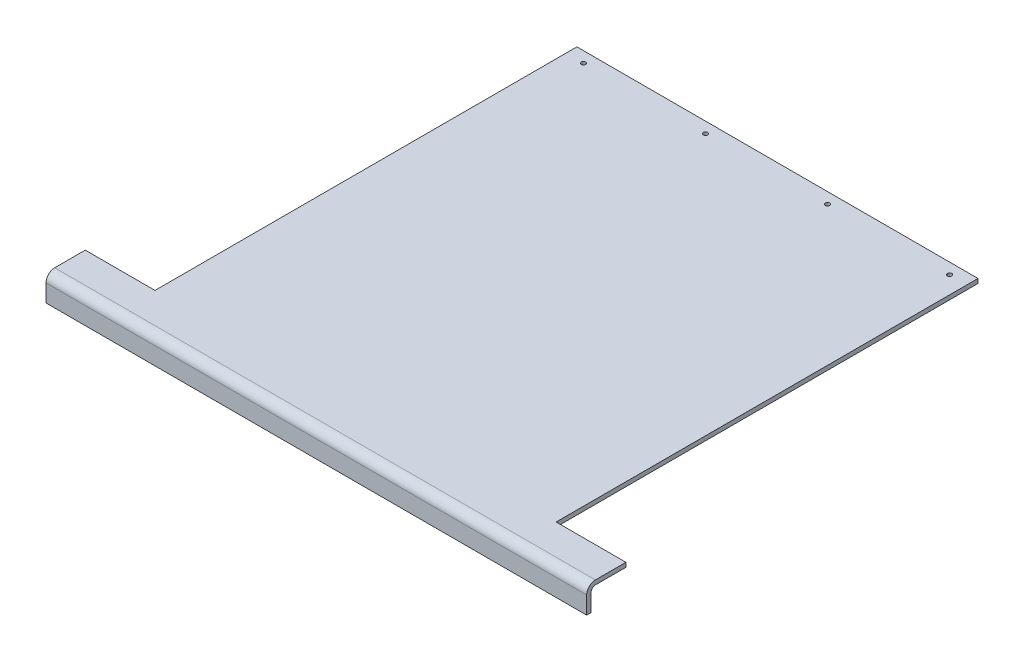
ISO-10303-21;
HEADER;
FILE_DESCRIPTION(('STEP AP214'),'2;1');
FILE_NAME('part.step','',(''),(''),'','','');
FILE_SCHEMA(('AUTOMOTIVE_DESIGN { 1 0 10303 214 1 1 1 1 }'));
ENDSEC;
DATA;
#1=APPLICATION_CONTEXT('core data for automotive mechanical design processes');
#2=APPLICATION_PROTOCOL_DEFINITION('international standard','automotive_design',2000,#1);
#3=PRODUCT_CONTEXT('',#1,'mechanical');
#4=PRODUCT('Part','Part','',(#3));
#5=PRODUCT_RELATED_PRODUCT_CATEGORY('part','',(#4));
#6=PRODUCT_DEFINITION_FORMATION('','',#4);
#7=PRODUCT_DEFINITION_CONTEXT('part definition',#1,'design');
#8=PRODUCT_DEFINITION('design','',#6,#7);
#9=PRODUCT_DEFINITION_SHAPE('','',#8);
#10=(LENGTH_UNIT() NAMED_UNIT(*) SI_UNIT(.MILLI.,.METRE.));
#11=(NAMED_UNIT(*) PLANE_ANGLE_UNIT() SI_UNIT($,.RADIAN.));
#12=(NAMED_UNIT(*) SI_UNIT($,.STERADIAN.) SOLID_ANGLE_UNIT());
#13=UNCERTAINTY_MEASURE_WITH_UNIT(LENGTH_MEASURE(1.E-05),#10,'distance_accuracy_value','');
#14=(GEOMETRIC_REPRESENTATION_CONTEXT(3) GLOBAL_UNCERTAINTY_ASSIGNED_CONTEXT((#13)) GLOBAL_UNIT_ASSIGNED_CONTEXT((#10,
#11,#12)) REPRESENTATION_CONTEXT('',''));
#15=CARTESIAN_POINT('',(0.,0.,0.));
#16=DIRECTION('',(0.,0.,1.));
#17=DIRECTION('',(1.,0.,0.));
#18=AXIS2_PLACEMENT_3D('',#15,#16,#17);
#19=CARTESIAN_POINT('',(-393.7,6.35,671.5252));
#20=DIRECTION('',(0.,0.,1.));
#21=DIRECTION('',(1.,0.,0.));
#22=AXIS2_PLACEMENT_3D('',#19,#20,#21);
#23=PLANE('',#22);
#24=DIRECTION('',(-1.,0.,0.));
#25=VECTOR('',#24,1.);
#26=CARTESIAN_POINT('',(393.7,-6.35,671.5252));
#27=LINE('',#26,#25);
#28=CARTESIAN_POINT('',(-393.7,-6.35,671.5252));
#29=VERTEX_POINT('',#28);
#30=CARTESIAN_POINT('',(393.7,-6.35,671.5252));
#31=VERTEX_POINT('',#30);
#32=EDGE_CURVE('E177',#29,#31,#27,.F.);
#33=ORIENTED_EDGE('',*,*,#32,.F.);
#34=DIRECTION('',(0.,1.,0.));
#35=VECTOR('',#34,1.);
#36=CARTESIAN_POINT('',(-393.7,-19.05,671.5252));
#37=LINE('',#36,#35);
#38=CARTESIAN_POINT('',(-393.7,-31.75,671.5252));
#39=VERTEX_POINT('',#38);
#40=EDGE_CURVE('E112',#39,#29,#37,.T.);
#41=ORIENTED_EDGE('',*,*,#40,.F.);
#42=DIRECTION('',(1.,0.,0.));
#43=VECTOR('',#42,1.);
#44=CARTESIAN_POINT('',(0.,-31.75,671.5252));
#45=LINE('',#44,#43);
#46=CARTESIAN_POINT('',(393.7,-31.75,671.5252));
#47=VERTEX_POINT('',#46);
#48=EDGE_CURVE('E199',#47,#39,#45,.F.);
#49=ORIENTED_EDGE('',*,*,#48,.F.);
#50=DIRECTION('',(0.,1.,0.));
#51=VECTOR('',#50,1.);
#52=CARTESIAN_POINT('',(393.7,-19.05,671.5252));
#53=LINE('',#52,#51);
#54=EDGE_CURVE('E180',#31,#47,#53,.F.);
#55=ORIENTED_EDGE('',*,*,#54,.F.);
#56=EDGE_LOOP('',(#33,#41,#49,#55));
#57=FACE_BOUND('',#56,.T.);
#58=ADVANCED_FACE('F17',(#57),#23,.T.);
#59=CARTESIAN_POINT('',(0.,-31.75,668.3502));
#60=DIRECTION('',(0.,-1.,0.));
#61=DIRECTION('',(0.,0.,-1.));
#62=AXIS2_PLACEMENT_3D('',#59,#60,#61);
#63=PLANE('',#62);
#64=DIRECTION('',(0.,0.,-1.));
#65=VECTOR('',#64,1.);
#66=CARTESIAN_POINT('',(393.7,-31.75,668.3502));
#67=LINE('',#66,#65);
#68=CARTESIAN_POINT('',(393.7,-31.75,665.1752));
#69=VERTEX_POINT('',#68);
#70=EDGE_CURVE('E183',#47,#69,#67,.T.);
#71=ORIENTED_EDGE('',*,*,#70,.F.);
#72=ORIENTED_EDGE('',*,*,#48,.T.);
#73=DIRECTION('',(0.,0.,1.));
#74=VECTOR('',#73,1.);
#75=CARTESIAN_POINT('',(-393.7,-31.75,668.3502));
#76=LINE('',#75,#74);
#77=CARTESIAN_POINT('',(-393.7,-31.75,665.1752));
#78=VERTEX_POINT('',#77);
#79=EDGE_CURVE('E187',#78,#39,#76,.T.);
#80=ORIENTED_EDGE('',*,*,#79,.F.);
#81=DIRECTION('',(1.,0.,0.));
#82=VECTOR('',#81,1.);
#83=CARTESIAN_POINT('',(-393.7,-31.75,665.1752));
#84=LINE('',#83,#82);
#85=EDGE_CURVE('E193',#78,#69,#84,.T.);
#86=ORIENTED_EDGE('',*,*,#85,.T.);
#87=EDGE_LOOP('',(#71,#72,#80,#86));
#88=FACE_BOUND('',#87,.T.);
#89=ADVANCED_FACE('F437',(#88),#63,.T.);
#90=CARTESIAN_POINT('',(393.7,-6.35,658.8252));
#91=DIRECTION('',(-1.,0.,0.));
#92=DIRECTION('',(0.,0.,1.));
#93=AXIS2_PLACEMENT_3D('',#90,#91,#92);
#94=CYLINDRICAL_SURFACE('',#93,12.7);
#95=CARTESIAN_POINT('',(-393.7,-6.35,658.8252));
#96=DIRECTION('',(-1.,0.,0.));
#97=DIRECTION('',(0.,0.,1.));
#98=AXIS2_PLACEMENT_3D('',#95,#96,#97);
#99=CIRCLE('',#98,12.7);
#100=CARTESIAN_POINT('',(-393.7,6.35,658.8252));
#101=VERTEX_POINT('',#100);
#102=EDGE_CURVE('E20',#101,#29,#99,.F.);
#103=ORIENTED_EDGE('',*,*,#102,.T.);
#104=ORIENTED_EDGE('',*,*,#32,.T.);
#105=CARTESIAN_POINT('',(393.7,-6.35,658.8252));
#106=DIRECTION('',(-1.,0.,0.));
#107=DIRECTION('',(0.,0.,1.));
#108=AXIS2_PLACEMENT_3D('',#105,#106,#107);
#109=CIRCLE('',#108,12.7);
#110=CARTESIAN_POINT('',(393.7,6.35,658.8252));
#111=VERTEX_POINT('',#110);
#112=EDGE_CURVE('E115',#111,#31,#109,.F.);
#113=ORIENTED_EDGE('',*,*,#112,.F.);
#114=DIRECTION('',(1.,0.,0.));
#115=VECTOR('',#114,1.);
#116=CARTESIAN_POINT('',(0.,6.35,658.8252));
#117=LINE('',#116,#115);
#118=EDGE_CURVE('E118',#101,#111,#117,.T.);
#119=ORIENTED_EDGE('',*,*,#118,.F.);
#120=EDGE_LOOP('',(#103,#104,#113,#119));
#121=FACE_BOUND('',#120,.T.);
#122=ADVANCED_FACE('F119',(#121),#94,.T.);
#123=CARTESIAN_POINT('',(-393.7,6.35,665.1752));
#124=DIRECTION('',(0.,0.,1.));
#125=DIRECTION('',(1.,0.,0.));
#126=AXIS2_PLACEMENT_3D('',#123,#124,#125);
#127=PLANE('',#126);
#128=DIRECTION('',(0.,1.,0.));
#129=VECTOR('',#128,1.);
#130=CARTESIAN_POINT('',(393.7,6.35,665.1752));
#131=LINE('',#130,#129);
#132=CARTESIAN_POINT('',(393.7,-6.35,665.1752));
#133=VERTEX_POINT('',#132);
#134=EDGE_CURVE('E116',#69,#133,#131,.T.);
#135=ORIENTED_EDGE('',*,*,#134,.F.);
#136=ORIENTED_EDGE('',*,*,#85,.F.);
#137=DIRECTION('',(0.,1.,0.));
#138=VECTOR('',#137,1.);
#139=CARTESIAN_POINT('',(-393.7,6.35,665.1752));
#140=LINE('',#139,#138);
#141=CARTESIAN_POINT('',(-393.7,-6.35,665.1752));
#142=VERTEX_POINT('',#141);
#143=EDGE_CURVE('E179',#142,#78,#140,.F.);
#144=ORIENTED_EDGE('',*,*,#143,.F.);
#145=DIRECTION('',(-1.,0.,0.));
#146=VECTOR('',#145,1.);
#147=CARTESIAN_POINT('',(393.7,-6.35,665.1752));
#148=LINE('',#147,#146);
#149=EDGE_CURVE('E129',#142,#133,#148,.F.);
#150=ORIENTED_EDGE('',*,*,#149,.T.);
#151=EDGE_LOOP('',(#135,#136,#144,#150));
#152=FACE_BOUND('',#151,.T.);
#153=ADVANCED_FACE('F260',(#152),#127,.F.);
#154=CARTESIAN_POINT('',(0.,6.35,0.));
#155=DIRECTION('',(0.,1.,0.));
#156=DIRECTION('',(0.,0.,1.));
#157=AXIS2_PLACEMENT_3D('',#154,#155,#156);
#158=PLANE('',#157);
#159=CARTESIAN_POINT('',(-266.7,6.35,15.875));
#160=DIRECTION('',(0.,1.,0.));
#161=DIRECTION('',(0.,0.,1.));
#162=AXIS2_PLACEMENT_3D('',#159,#160,#161);
#163=CIRCLE('',#162,3.175);
#164=CARTESIAN_POINT('',(-266.7,6.35,19.05));
#165=VERTEX_POINT('',#164);
#166=EDGE_CURVE('E170',#165,#165,#163,.F.);
#167=ORIENTED_EDGE('',*,*,#166,.T.);
#168=EDGE_LOOP('',(#167));
#169=FACE_BOUND('',#168,.T.);
#170=CARTESIAN_POINT('',(-88.9,6.35,15.875));
#171=DIRECTION('',(0.,1.,0.));
#172=DIRECTION('',(0.,0.,1.));
#173=AXIS2_PLACEMENT_3D('',#170,#171,#172);
#174=CIRCLE('',#173,3.175);
#175=CARTESIAN_POINT('',(-88.9,6.35,19.05));
#176=VERTEX_POINT('',#175);
#177=EDGE_CURVE('E219',#176,#176,#174,.F.);
#178=ORIENTED_EDGE('',*,*,#177,.T.);
#179=EDGE_LOOP('',(#178));
#180=FACE_BOUND('',#179,.T.);
#181=CARTESIAN_POINT('',(88.9,6.35,15.875));
#182=DIRECTION('',(0.,1.,0.));
#183=DIRECTION('',(0.,0.,1.));
#184=AXIS2_PLACEMENT_3D('',#181,#182,#183);
#185=CIRCLE('',#184,3.175);
#186=CARTESIAN_POINT('',(88.9,6.35,19.05));
#187=VERTEX_POINT('',#186);
#188=EDGE_CURVE('E216',#187,#187,#185,.F.);
#189=ORIENTED_EDGE('',*,*,#188,.T.);
#190=EDGE_LOOP('',(#189));
#191=FACE_BOUND('',#190,.T.);
#192=CARTESIAN_POINT('',(266.7,6.35,15.875));
#193=DIRECTION('',(0.,1.,0.));
#194=DIRECTION('',(0.,0.,1.));
#195=AXIS2_PLACEMENT_3D('',#192,#193,#194);
#196=CIRCLE('',#195,3.175);
#197=CARTESIAN_POINT('',(266.7,6.35,19.05));
#198=VERTEX_POINT('',#197);
#199=EDGE_CURVE('E164',#198,#198,#196,.F.);
#200=ORIENTED_EDGE('',*,*,#199,.T.);
#201=EDGE_LOOP('',(#200));
#202=FACE_BOUND('',#201,.T.);
#203=DIRECTION('',(1.,0.,0.));
#204=VECTOR('',#203,1.);
#205=CARTESIAN_POINT('',(0.,6.35,0.));
#206=LINE('',#205,#204);
#207=CARTESIAN_POINT('',(292.1,6.35,0.));
#208=VERTEX_POINT('',#207);
#209=CARTESIAN_POINT('',(-292.1,6.35,0.));
#210=VERTEX_POINT('',#209);
#211=EDGE_CURVE('E171',#208,#210,#206,.F.);
#212=ORIENTED_EDGE('',*,*,#211,.T.);
#213=DIRECTION('',(0.,0.,-1.));
#214=VECTOR('',#213,1.);
#215=CARTESIAN_POINT('',(-292.1,6.35,307.1876));
#216=LINE('',#215,#214);
#217=CARTESIAN_POINT('',(-292.1,6.35,614.3752));
#218=VERTEX_POINT('',#217);
#219=EDGE_CURVE('E123',#210,#218,#216,.F.);
#220=ORIENTED_EDGE('',*,*,#219,.T.);
#221=DIRECTION('',(1.,0.,0.));
#222=VECTOR('',#221,1.);
#223=CARTESIAN_POINT('',(-342.9,6.35,614.3752));
#224=LINE('',#223,#222);
#225=CARTESIAN_POINT('',(-393.7,6.35,614.3752));
#226=VERTEX_POINT('',#225);
#227=EDGE_CURVE('E128',#218,#226,#224,.F.);
#228=ORIENTED_EDGE('',*,*,#227,.T.);
#229=DIRECTION('',(0.,0.,-1.));
#230=VECTOR('',#229,1.);
#231=CARTESIAN_POINT('',(-393.7,6.35,642.9502));
#232=LINE('',#231,#230);
#233=EDGE_CURVE('E108',#226,#101,#232,.F.);
#234=ORIENTED_EDGE('',*,*,#233,.T.);
#235=ORIENTED_EDGE('',*,*,#118,.T.);
#236=DIRECTION('',(0.,0.,1.));
#237=VECTOR('',#236,1.);
#238=CARTESIAN_POINT('',(393.7,6.35,642.9502));
#239=LINE('',#238,#237);
#240=CARTESIAN_POINT('',(393.7,6.35,614.3752));
#241=VERTEX_POINT('',#240);
#242=EDGE_CURVE('E227',#111,#241,#239,.F.);
#243=ORIENTED_EDGE('',*,*,#242,.T.);
#244=DIRECTION('',(1.,0.,0.));
#245=VECTOR('',#244,1.);
#246=CARTESIAN_POINT('',(342.9,6.35,614.3752));
#247=LINE('',#246,#245);
#248=CARTESIAN_POINT('',(292.1,6.35,614.3752));
#249=VERTEX_POINT('',#248);
#250=EDGE_CURVE('E237',#241,#249,#247,.F.);
#251=ORIENTED_EDGE('',*,*,#250,.T.);
#252=DIRECTION('',(0.,0.,1.));
#253=VECTOR('',#252,1.);
#254=CARTESIAN_POINT('',(292.1,6.35,307.1876));
#255=LINE('',#254,#253);
#256=EDGE_CURVE('E277',#249,#208,#255,.F.);
#257=ORIENTED_EDGE('',*,*,#256,.T.);
#258=EDGE_LOOP('',(#212,#220,#228,#234,#235,#243,#251,#257));
#259=FACE_BOUND('',#258,.T.);
#260=ADVANCED_FACE('F126',(#169,#180,#191,#202,#259),#158,.T.);
#261=CARTESIAN_POINT('',(-292.1,3.175,307.1876));
#262=DIRECTION('',(1.,0.,0.));
#263=DIRECTION('',(0.,0.,-1.));
#264=AXIS2_PLACEMENT_3D('',#261,#262,#263);
#265=PLANE('',#264);
#266=ORIENTED_EDGE('',*,*,#219,.F.);
#267=DIRECTION('',(0.,1.,0.));
#268=VECTOR('',#267,1.);
#269=CARTESIAN_POINT('',(-292.1,3.175,0.));
#270=LINE('',#269,#268);
#271=CARTESIAN_POINT('',(-292.1,0.,0.));
#272=VERTEX_POINT('',#271);
#273=EDGE_CURVE('E167',#210,#272,#270,.F.);
#274=ORIENTED_EDGE('',*,*,#273,.T.);
#275=DIRECTION('',(0.,0.,1.));
#276=VECTOR('',#275,1.);
#277=CARTESIAN_POINT('',(-292.1,0.,0.));
#278=LINE('',#277,#276);
#279=CARTESIAN_POINT('',(-292.1,0.,614.3752));
#280=VERTEX_POINT('',#279);
#281=EDGE_CURVE('E152',#272,#280,#278,.T.);
#282=ORIENTED_EDGE('',*,*,#281,.T.);
#283=DIRECTION('',(0.,1.,0.));
#284=VECTOR('',#283,1.);
#285=CARTESIAN_POINT('',(-292.1,3.175,614.3752));
#286=LINE('',#285,#284);
#287=EDGE_CURVE('E145',#280,#218,#286,.T.);
#288=ORIENTED_EDGE('',*,*,#287,.T.);
#289=EDGE_LOOP('',(#266,#274,#282,#288));
#290=FACE_BOUND('',#289,.T.);
#291=ADVANCED_FACE('F292',(#290),#265,.F.);
#292=CARTESIAN_POINT('',(-342.9,3.175,614.3752));
#293=DIRECTION('',(0.,0.,1.));
#294=DIRECTION('',(1.,0.,0.));
#295=AXIS2_PLACEMENT_3D('',#292,#293,#294);
#296=PLANE('',#295);
#297=ORIENTED_EDGE('',*,*,#227,.F.);
#298=ORIENTED_EDGE('',*,*,#287,.F.);
#299=DIRECTION('',(1.,0.,0.));
#300=VECTOR('',#299,1.);
#301=CARTESIAN_POINT('',(0.,0.,614.3752));
#302=LINE('',#301,#300);
#303=CARTESIAN_POINT('',(-393.7,0.,614.3752));
#304=VERTEX_POINT('',#303);
#305=EDGE_CURVE('E148',#280,#304,#302,.F.);
#306=ORIENTED_EDGE('',*,*,#305,.T.);
#307=DIRECTION('',(0.,1.,0.));
#308=VECTOR('',#307,1.);
#309=CARTESIAN_POINT('',(-393.7,3.175,614.3752));
#310=LINE('',#309,#308);
#311=EDGE_CURVE('E130',#304,#226,#310,.T.);
#312=ORIENTED_EDGE('',*,*,#311,.T.);
#313=EDGE_LOOP('',(#297,#298,#306,#312));
#314=FACE_BOUND('',#313,.T.);
#315=ADVANCED_FACE('F291',(#314),#296,.F.);
#316=CARTESIAN_POINT('',(-393.7,3.175,642.9502));
#317=DIRECTION('',(1.,0.,0.));
#318=DIRECTION('',(0.,0.,-1.));
#319=AXIS2_PLACEMENT_3D('',#316,#317,#318);
#320=PLANE('',#319);
#321=ORIENTED_EDGE('',*,*,#233,.F.);
#322=ORIENTED_EDGE('',*,*,#311,.F.);
#323=DIRECTION('',(0.,0.,1.));
#324=VECTOR('',#323,1.);
#325=CARTESIAN_POINT('',(-393.7,0.,0.));
#326=LINE('',#325,#324);
#327=CARTESIAN_POINT('',(-393.7,0.,658.8252));
#328=VERTEX_POINT('',#327);
#329=EDGE_CURVE('E151',#304,#328,#326,.T.);
#330=ORIENTED_EDGE('',*,*,#329,.T.);
#331=CARTESIAN_POINT('',(-393.7,-6.35,658.8252));
#332=DIRECTION('',(-1.,0.,0.));
#333=DIRECTION('',(0.,0.,1.));
#334=AXIS2_PLACEMENT_3D('',#331,#332,#333);
#335=CIRCLE('',#334,6.35);
#336=EDGE_CURVE('E224',#328,#142,#335,.F.);
#337=ORIENTED_EDGE('',*,*,#336,.T.);
#338=ORIENTED_EDGE('',*,*,#143,.T.);
#339=ORIENTED_EDGE('',*,*,#79,.T.);
#340=ORIENTED_EDGE('',*,*,#40,.T.);
#341=ORIENTED_EDGE('',*,*,#102,.F.);
#342=EDGE_LOOP('',(#321,#322,#330,#337,#338,#339,#340,#341));
#343=FACE_BOUND('',#342,.T.);
#344=ADVANCED_FACE('F106',(#343),#320,.F.);
#345=CARTESIAN_POINT('',(393.7,-6.35,658.8252));
#346=DIRECTION('',(-1.,0.,0.));
#347=DIRECTION('',(0.,0.,1.));
#348=AXIS2_PLACEMENT_3D('',#345,#346,#347);
#349=CYLINDRICAL_SURFACE('',#348,6.35);
#350=DIRECTION('',(1.,0.,0.));
#351=VECTOR('',#350,1.);
#352=CARTESIAN_POINT('',(0.,0.,658.8252));
#353=LINE('',#352,#351);
#354=CARTESIAN_POINT('',(393.7,0.,658.8252));
#355=VERTEX_POINT('',#354);
#356=EDGE_CURVE('E240',#328,#355,#353,.T.);
#357=ORIENTED_EDGE('',*,*,#356,.T.);
#358=CARTESIAN_POINT('',(393.7,-6.35,658.8252));
#359=DIRECTION('',(-1.,0.,0.));
#360=DIRECTION('',(0.,0.,1.));
#361=AXIS2_PLACEMENT_3D('',#358,#359,#360);
#362=CIRCLE('',#361,6.35);
#363=EDGE_CURVE('E133',#133,#355,#362,.T.);
#364=ORIENTED_EDGE('',*,*,#363,.F.);
#365=ORIENTED_EDGE('',*,*,#149,.F.);
#366=ORIENTED_EDGE('',*,*,#336,.F.);
#367=EDGE_LOOP('',(#357,#364,#365,#366));
#368=FACE_BOUND('',#367,.T.);
#369=ADVANCED_FACE('F258',(#368),#349,.F.);
#370=CARTESIAN_POINT('',(393.7,3.175,642.9502));
#371=DIRECTION('',(-1.,0.,0.));
#372=DIRECTION('',(0.,0.,1.));
#373=AXIS2_PLACEMENT_3D('',#370,#371,#372);
#374=PLANE('',#373);
#375=ORIENTED_EDGE('',*,*,#242,.F.);
#376=ORIENTED_EDGE('',*,*,#112,.T.);
#377=ORIENTED_EDGE('',*,*,#54,.T.);
#378=ORIENTED_EDGE('',*,*,#70,.T.);
#379=ORIENTED_EDGE('',*,*,#134,.T.);
#380=ORIENTED_EDGE('',*,*,#363,.T.);
#381=DIRECTION('',(0.,0.,1.));
#382=VECTOR('',#381,1.);
#383=CARTESIAN_POINT('',(393.7,0.,0.));
#384=LINE('',#383,#382);
#385=CARTESIAN_POINT('',(393.7,0.,614.3752));
#386=VERTEX_POINT('',#385);
#387=EDGE_CURVE('E267',#355,#386,#384,.F.);
#388=ORIENTED_EDGE('',*,*,#387,.T.);
#389=DIRECTION('',(0.,1.,0.));
#390=VECTOR('',#389,1.);
#391=CARTESIAN_POINT('',(393.7,3.175,614.3752));
#392=LINE('',#391,#390);
#393=EDGE_CURVE('E234',#386,#241,#392,.T.);
#394=ORIENTED_EDGE('',*,*,#393,.T.);
#395=EDGE_LOOP('',(#375,#376,#377,#378,#379,#380,#388,#394));
#396=FACE_BOUND('',#395,.T.);
#397=ADVANCED_FACE('F229',(#396),#374,.F.);
#398=CARTESIAN_POINT('',(342.9,3.175,614.3752));
#399=DIRECTION('',(0.,0.,1.));
#400=DIRECTION('',(1.,0.,0.));
#401=AXIS2_PLACEMENT_3D('',#398,#399,#400);
#402=PLANE('',#401);
#403=ORIENTED_EDGE('',*,*,#250,.F.);
#404=ORIENTED_EDGE('',*,*,#393,.F.);
#405=DIRECTION('',(1.,0.,0.));
#406=VECTOR('',#405,1.);
#407=CARTESIAN_POINT('',(0.,0.,614.3752));
#408=LINE('',#407,#406);
#409=CARTESIAN_POINT('',(292.1,0.,614.3752));
#410=VERTEX_POINT('',#409);
#411=EDGE_CURVE('E268',#386,#410,#408,.F.);
#412=ORIENTED_EDGE('',*,*,#411,.T.);
#413=DIRECTION('',(0.,1.,0.));
#414=VECTOR('',#413,1.);
#415=CARTESIAN_POINT('',(292.1,3.175,614.3752));
#416=LINE('',#415,#414);
#417=EDGE_CURVE('E274',#410,#249,#416,.T.);
#418=ORIENTED_EDGE('',*,*,#417,.T.);
#419=EDGE_LOOP('',(#403,#404,#412,#418));
#420=FACE_BOUND('',#419,.T.);
#421=ADVANCED_FACE('F288',(#420),#402,.F.);
#422=CARTESIAN_POINT('',(292.1,3.175,307.1876));
#423=DIRECTION('',(-1.,0.,0.));
#424=DIRECTION('',(0.,0.,1.));
#425=AXIS2_PLACEMENT_3D('',#422,#423,#424);
#426=PLANE('',#425);
#427=ORIENTED_EDGE('',*,*,#256,.F.);
#428=ORIENTED_EDGE('',*,*,#417,.F.);
#429=DIRECTION('',(0.,0.,1.));
#430=VECTOR('',#429,1.);
#431=CARTESIAN_POINT('',(292.1,0.,0.));
#432=LINE('',#431,#430);
#433=CARTESIAN_POINT('',(292.1,0.,0.));
#434=VERTEX_POINT('',#433);
#435=EDGE_CURVE('E270',#410,#434,#432,.F.);
#436=ORIENTED_EDGE('',*,*,#435,.T.);
#437=DIRECTION('',(0.,1.,0.));
#438=VECTOR('',#437,1.);
#439=CARTESIAN_POINT('',(292.1,3.175,0.));
#440=LINE('',#439,#438);
#441=EDGE_CURVE('E35',#434,#208,#440,.T.);
#442=ORIENTED_EDGE('',*,*,#441,.T.);
#443=EDGE_LOOP('',(#427,#428,#436,#442));
#444=FACE_BOUND('',#443,.T.);
#445=ADVANCED_FACE('F286',(#444),#426,.F.);
#446=CARTESIAN_POINT('',(0.,3.175,0.));
#447=DIRECTION('',(0.,0.,1.));
#448=DIRECTION('',(1.,0.,0.));
#449=AXIS2_PLACEMENT_3D('',#446,#447,#448);
#450=PLANE('',#449);
#451=ORIENTED_EDGE('',*,*,#211,.F.);
#452=ORIENTED_EDGE('',*,*,#441,.F.);
#453=DIRECTION('',(1.,0.,0.));
#454=VECTOR('',#453,1.);
#455=CARTESIAN_POINT('',(0.,0.,0.));
#456=LINE('',#455,#454);
#457=EDGE_CURVE('E213',#434,#272,#456,.F.);
#458=ORIENTED_EDGE('',*,*,#457,.T.);
#459=ORIENTED_EDGE('',*,*,#273,.F.);
#460=EDGE_LOOP('',(#451,#452,#458,#459));
#461=FACE_BOUND('',#460,.T.);
#462=ADVANCED_FACE('F283',(#461),#450,.F.);
#463=CARTESIAN_POINT('',(-266.7,3.175,15.875));
#464=DIRECTION('',(0.,1.,0.));
#465=DIRECTION('',(0.,0.,1.));
#466=AXIS2_PLACEMENT_3D('',#463,#464,#465);
#467=CYLINDRICAL_SURFACE('',#466,3.175);
#468=ORIENTED_EDGE('',*,*,#166,.F.);
#469=EDGE_LOOP('',(#468));
#470=FACE_BOUND('',#469,.T.);
#471=CARTESIAN_POINT('',(-266.7,0.,15.875));
#472=DIRECTION('',(0.,1.,0.));
#473=DIRECTION('',(0.,0.,1.));
#474=AXIS2_PLACEMENT_3D('',#471,#472,#473);
#475=CIRCLE('',#474,3.175);
#476=CARTESIAN_POINT('',(-266.7,0.,19.05));
#477=VERTEX_POINT('',#476);
#478=EDGE_CURVE('E210',#477,#477,#475,.F.);
#479=ORIENTED_EDGE('',*,*,#478,.T.);
#480=EDGE_LOOP('',(#479));
#481=FACE_BOUND('',#480,.T.);
#482=ADVANCED_FACE('F322',(#470,#481),#467,.F.);
#483=CARTESIAN_POINT('',(-88.9,3.175,15.875));
#484=DIRECTION('',(0.,1.,0.));
#485=DIRECTION('',(0.,0.,1.));
#486=AXIS2_PLACEMENT_3D('',#483,#484,#485);
#487=CYLINDRICAL_SURFACE('',#486,3.175);
#488=ORIENTED_EDGE('',*,*,#177,.F.);
#489=EDGE_LOOP('',(#488));
#490=FACE_BOUND('',#489,.T.);
#491=CARTESIAN_POINT('',(-88.9,0.,15.875));
#492=DIRECTION('',(0.,1.,0.));
#493=DIRECTION('',(0.,0.,1.));
#494=AXIS2_PLACEMENT_3D('',#491,#492,#493);
#495=CIRCLE('',#494,3.175);
#496=CARTESIAN_POINT('',(-88.9,0.,19.05));
#497=VERTEX_POINT('',#496);
#498=EDGE_CURVE('E207',#497,#497,#495,.F.);
#499=ORIENTED_EDGE('',*,*,#498,.T.);
#500=EDGE_LOOP('',(#499));
#501=FACE_BOUND('',#500,.T.);
#502=ADVANCED_FACE('F318',(#490,#501),#487,.F.);
#503=CARTESIAN_POINT('',(88.9,3.175,15.875));
#504=DIRECTION('',(0.,1.,0.));
#505=DIRECTION('',(0.,0.,1.));
#506=AXIS2_PLACEMENT_3D('',#503,#504,#505);
#507=CYLINDRICAL_SURFACE('',#506,3.175);
#508=ORIENTED_EDGE('',*,*,#188,.F.);
#509=EDGE_LOOP('',(#508));
#510=FACE_BOUND('',#509,.T.);
#511=CARTESIAN_POINT('',(88.9,0.,15.875));
#512=DIRECTION('',(0.,1.,0.));
#513=DIRECTION('',(0.,0.,1.));
#514=AXIS2_PLACEMENT_3D('',#511,#512,#513);
#515=CIRCLE('',#514,3.175);
#516=CARTESIAN_POINT('',(88.9,0.,19.05));
#517=VERTEX_POINT('',#516);
#518=EDGE_CURVE('E26',#517,#517,#515,.F.);
#519=ORIENTED_EDGE('',*,*,#518,.T.);
#520=EDGE_LOOP('',(#519));
#521=FACE_BOUND('',#520,.T.);
#522=ADVANCED_FACE('F310',(#510,#521),#507,.F.);
#523=CARTESIAN_POINT('',(266.7,3.175,15.875));
#524=DIRECTION('',(0.,1.,0.));
#525=DIRECTION('',(0.,0.,1.));
#526=AXIS2_PLACEMENT_3D('',#523,#524,#525);
#527=CYLINDRICAL_SURFACE('',#526,3.175);
#528=ORIENTED_EDGE('',*,*,#199,.F.);
#529=EDGE_LOOP('',(#528));
#530=FACE_BOUND('',#529,.T.);
#531=CARTESIAN_POINT('',(266.7,0.,15.875));
#532=DIRECTION('',(0.,1.,0.));
#533=DIRECTION('',(0.,0.,1.));
#534=AXIS2_PLACEMENT_3D('',#531,#532,#533);
#535=CIRCLE('',#534,3.175);
#536=CARTESIAN_POINT('',(266.7,0.,19.05));
#537=VERTEX_POINT('',#536);
#538=EDGE_CURVE('E11',#537,#537,#535,.F.);
#539=ORIENTED_EDGE('',*,*,#538,.T.);
#540=EDGE_LOOP('',(#539));
#541=FACE_BOUND('',#540,.T.);
#542=ADVANCED_FACE('F304',(#530,#541),#527,.F.);
#543=CARTESIAN_POINT('',(0.,0.,0.));
#544=DIRECTION('',(0.,1.,0.));
#545=DIRECTION('',(0.,0.,1.));
#546=AXIS2_PLACEMENT_3D('',#543,#544,#545);
#547=PLANE('',#546);
#548=ORIENTED_EDGE('',*,*,#538,.F.);
#549=EDGE_LOOP('',(#548));
#550=FACE_BOUND('',#549,.T.);
#551=ORIENTED_EDGE('',*,*,#518,.F.);
#552=EDGE_LOOP('',(#551));
#553=FACE_BOUND('',#552,.T.);
#554=ORIENTED_EDGE('',*,*,#498,.F.);
#555=EDGE_LOOP('',(#554));
#556=FACE_BOUND('',#555,.T.);
#557=ORIENTED_EDGE('',*,*,#478,.F.);
#558=EDGE_LOOP('',(#557));
#559=FACE_BOUND('',#558,.T.);
#560=ORIENTED_EDGE('',*,*,#435,.F.);
#561=ORIENTED_EDGE('',*,*,#411,.F.);
#562=ORIENTED_EDGE('',*,*,#387,.F.);
#563=ORIENTED_EDGE('',*,*,#356,.F.);
#564=ORIENTED_EDGE('',*,*,#329,.F.);
#565=ORIENTED_EDGE('',*,*,#305,.F.);
#566=ORIENTED_EDGE('',*,*,#281,.F.);
#567=ORIENTED_EDGE('',*,*,#457,.F.);
#568=EDGE_LOOP('',(#560,#561,#562,#563,#564,#565,#566,#567));
#569=FACE_BOUND('',#568,.T.);
#570=ADVANCED_FACE('F264',(#550,#553,#556,#559,#569),#547,.F.);
#571=CLOSED_SHELL('',(#58,#89,#122,#153,#260,#291,#315,#344,#369,#397,#421,#445,#462,#482,#502,
#522,#542,#570));
#572=MANIFOLD_SOLID_BREP('B1',#571);
#573=ADVANCED_BREP_SHAPE_REPRESENTATION('',(#18,#572),#14);
#574=SHAPE_DEFINITION_REPRESENTATION(#9,#573);
ENDSEC;
END-ISO-10303-21;
